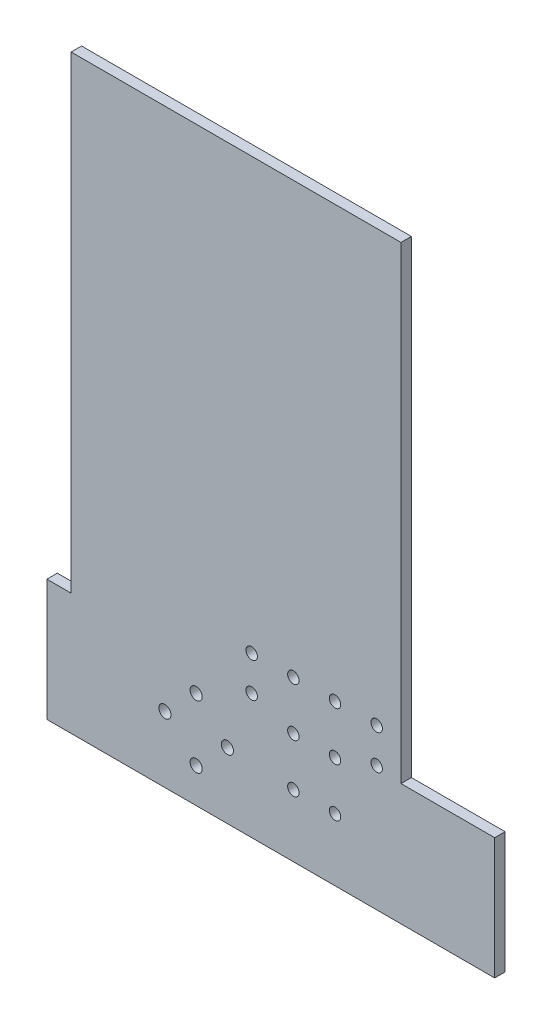
ISO-10303-21;
HEADER;
FILE_DESCRIPTION(('STEP AP214'),'2;1');
FILE_NAME('part.step','',(''),(''),'','','');
FILE_SCHEMA(('AUTOMOTIVE_DESIGN { 1 0 10303 214 1 1 1 1 }'));
ENDSEC;
DATA;
#1=APPLICATION_CONTEXT('core data for automotive mechanical design processes');
#2=APPLICATION_PROTOCOL_DEFINITION('international standard','automotive_design',2000,#1);
#3=PRODUCT_CONTEXT('',#1,'mechanical');
#4=PRODUCT('Part','Part','',(#3));
#5=PRODUCT_RELATED_PRODUCT_CATEGORY('part','',(#4));
#6=PRODUCT_DEFINITION_FORMATION('','',#4);
#7=PRODUCT_DEFINITION_CONTEXT('part definition',#1,'design');
#8=PRODUCT_DEFINITION('design','',#6,#7);
#9=PRODUCT_DEFINITION_SHAPE('','',#8);
#10=(LENGTH_UNIT() NAMED_UNIT(*) SI_UNIT(.MILLI.,.METRE.));
#11=(NAMED_UNIT(*) PLANE_ANGLE_UNIT() SI_UNIT($,.RADIAN.));
#12=(NAMED_UNIT(*) SI_UNIT($,.STERADIAN.) SOLID_ANGLE_UNIT());
#13=UNCERTAINTY_MEASURE_WITH_UNIT(LENGTH_MEASURE(1.E-05),#10,'distance_accuracy_value','');
#14=(GEOMETRIC_REPRESENTATION_CONTEXT(3) GLOBAL_UNCERTAINTY_ASSIGNED_CONTEXT((#13)) GLOBAL_UNIT_ASSIGNED_CONTEXT((#10,
#11,#12)) REPRESENTATION_CONTEXT('',''));
#15=CARTESIAN_POINT('',(0.,0.,0.));
#16=DIRECTION('',(0.,0.,1.));
#17=DIRECTION('',(1.,0.,0.));
#18=AXIS2_PLACEMENT_3D('',#15,#16,#17);
#19=CARTESIAN_POINT('',(0.,0.,3.));
#20=DIRECTION('',(0.,-1.,0.));
#21=DIRECTION('',(0.,0.,-1.));
#22=AXIS2_PLACEMENT_3D('',#19,#20,#21);
#23=PLANE('',#22);
#24=DIRECTION('',(0.,0.,1.));
#25=VECTOR('',#24,1.);
#26=CARTESIAN_POINT('',(-17.,0.,0.));
#27=LINE('',#26,#25);
#28=CARTESIAN_POINT('',(-17.,0.,0.));
#29=VERTEX_POINT('',#28);
#30=CARTESIAN_POINT('',(-17.,0.,3.));
#31=VERTEX_POINT('',#30);
#32=EDGE_CURVE('E137',#29,#31,#27,.T.);
#33=ORIENTED_EDGE('',*,*,#32,.F.);
#34=DIRECTION('',(-1.,0.,0.));
#35=VECTOR('',#34,1.);
#36=CARTESIAN_POINT('',(0.,0.,0.));
#37=LINE('',#36,#35);
#38=CARTESIAN_POINT('',(-24.,0.,0.));
#39=VERTEX_POINT('',#38);
#40=EDGE_CURVE('E79',#29,#39,#37,.T.);
#41=ORIENTED_EDGE('',*,*,#40,.T.);
#42=DIRECTION('',(0.,0.,1.));
#43=VECTOR('',#42,1.);
#44=CARTESIAN_POINT('',(-24.,0.,0.));
#45=LINE('',#44,#43);
#46=CARTESIAN_POINT('',(-24.,0.,3.));
#47=VERTEX_POINT('',#46);
#48=EDGE_CURVE('E128',#39,#47,#45,.T.);
#49=ORIENTED_EDGE('',*,*,#48,.T.);
#50=DIRECTION('',(-1.,0.,0.));
#51=VECTOR('',#50,1.);
#52=CARTESIAN_POINT('',(0.,0.,3.));
#53=LINE('',#52,#51);
#54=EDGE_CURVE('E102',#31,#47,#53,.T.);
#55=ORIENTED_EDGE('',*,*,#54,.F.);
#56=EDGE_LOOP('',(#33,#41,#49,#55));
#57=FACE_BOUND('',#56,.T.);
#58=ADVANCED_FACE('F35',(#57),#23,.F.);
#59=CARTESIAN_POINT('',(0.,0.,3.));
#60=DIRECTION('',(0.,0.,1.));
#61=DIRECTION('',(1.,0.,0.));
#62=AXIS2_PLACEMENT_3D('',#59,#60,#61);
#63=PLANE('',#62);
#64=CARTESIAN_POINT('',(47.,-17.000000000004,3.));
#65=DIRECTION('',(0.,0.,1.));
#66=DIRECTION('',(1.,0.,0.));
#67=AXIS2_PLACEMENT_3D('',#64,#65,#66);
#68=CIRCLE('',#67,1.65000000000128);
#69=CARTESIAN_POINT('',(48.6500000000013,-17.000000000004,3.));
#70=VERTEX_POINT('',#69);
#71=EDGE_CURVE('E194',#70,#70,#68,.T.);
#72=ORIENTED_EDGE('',*,*,#71,.F.);
#73=EDGE_LOOP('',(#72));
#74=FACE_BOUND('',#73,.T.);
#75=CARTESIAN_POINT('',(71.,0.999999999996025,3.));
#76=DIRECTION('',(0.,0.,1.));
#77=DIRECTION('',(1.,0.,0.));
#78=AXIS2_PLACEMENT_3D('',#75,#76,#77);
#79=CIRCLE('',#78,1.65000000000128);
#80=CARTESIAN_POINT('',(72.6500000000013,0.999999999996025,3.));
#81=VERTEX_POINT('',#80);
#82=EDGE_CURVE('E201',#81,#81,#79,.T.);
#83=ORIENTED_EDGE('',*,*,#82,.F.);
#84=EDGE_LOOP('',(#83));
#85=FACE_BOUND('',#84,.T.);
#86=CARTESIAN_POINT('',(35.,0.999999999996032,3.));
#87=DIRECTION('',(0.,0.,1.));
#88=DIRECTION('',(1.,0.,0.));
#89=AXIS2_PLACEMENT_3D('',#86,#87,#88);
#90=CIRCLE('',#89,1.65000000000128);
#91=CARTESIAN_POINT('',(36.6500000000013,0.999999999996032,3.));
#92=VERTEX_POINT('',#91);
#93=EDGE_CURVE('E207',#92,#92,#90,.T.);
#94=ORIENTED_EDGE('',*,*,#93,.F.);
#95=EDGE_LOOP('',(#94));
#96=FACE_BOUND('',#95,.T.);
#97=CARTESIAN_POINT('',(35.,10.999999999996,3.));
#98=DIRECTION('',(0.,0.,1.));
#99=DIRECTION('',(1.,0.,0.));
#100=AXIS2_PLACEMENT_3D('',#97,#98,#99);
#101=CIRCLE('',#100,1.65000000000128);
#102=CARTESIAN_POINT('',(36.6500000000013,10.999999999996,3.));
#103=VERTEX_POINT('',#102);
#104=EDGE_CURVE('E213',#103,#103,#101,.T.);
#105=ORIENTED_EDGE('',*,*,#104,.F.);
#106=EDGE_LOOP('',(#105));
#107=FACE_BOUND('',#106,.T.);
#108=CARTESIAN_POINT('',(59.,-3.00000000000397,3.));
#109=DIRECTION('',(0.,0.,1.));
#110=DIRECTION('',(1.,0.,0.));
#111=AXIS2_PLACEMENT_3D('',#108,#109,#110);
#112=CIRCLE('',#111,1.65000000000128);
#113=CARTESIAN_POINT('',(60.6500000000013,-3.00000000000397,3.));
#114=VERTEX_POINT('',#113);
#115=EDGE_CURVE('E177',#114,#114,#112,.T.);
#116=ORIENTED_EDGE('',*,*,#115,.F.);
#117=EDGE_LOOP('',(#116));
#118=FACE_BOUND('',#117,.T.);
#119=CARTESIAN_POINT('',(47.,10.999999999996,3.));
#120=DIRECTION('',(0.,0.,1.));
#121=DIRECTION('',(1.,0.,0.));
#122=AXIS2_PLACEMENT_3D('',#119,#120,#121);
#123=CIRCLE('',#122,1.65000000000128);
#124=CARTESIAN_POINT('',(48.6500000000013,10.999999999996,3.));
#125=VERTEX_POINT('',#124);
#126=EDGE_CURVE('E170',#125,#125,#123,.T.);
#127=ORIENTED_EDGE('',*,*,#126,.F.);
#128=EDGE_LOOP('',(#127));
#129=FACE_BOUND('',#128,.T.);
#130=CARTESIAN_POINT('',(59.,10.999999999996,3.));
#131=DIRECTION('',(0.,0.,1.));
#132=DIRECTION('',(1.,0.,0.));
#133=AXIS2_PLACEMENT_3D('',#130,#131,#132);
#134=CIRCLE('',#133,1.65000000000128);
#135=CARTESIAN_POINT('',(60.6500000000013,10.999999999996,3.));
#136=VERTEX_POINT('',#135);
#137=EDGE_CURVE('E189',#136,#136,#134,.T.);
#138=ORIENTED_EDGE('',*,*,#137,.F.);
#139=EDGE_LOOP('',(#138));
#140=FACE_BOUND('',#139,.T.);
#141=CARTESIAN_POINT('',(71.,10.999999999996,3.));
#142=DIRECTION('',(0.,0.,1.));
#143=DIRECTION('',(1.,0.,0.));
#144=AXIS2_PLACEMENT_3D('',#141,#142,#143);
#145=CIRCLE('',#144,1.65000000000128);
#146=CARTESIAN_POINT('',(72.6500000000013,10.999999999996,3.));
#147=VERTEX_POINT('',#146);
#148=EDGE_CURVE('E182',#147,#147,#145,.T.);
#149=ORIENTED_EDGE('',*,*,#148,.F.);
#150=EDGE_LOOP('',(#149));
#151=FACE_BOUND('',#150,.T.);
#152=CARTESIAN_POINT('',(59.,-17.000000000004,3.));
#153=DIRECTION('',(0.,0.,1.));
#154=DIRECTION('',(1.,0.,0.));
#155=AXIS2_PLACEMENT_3D('',#152,#153,#154);
#156=CIRCLE('',#155,1.65000000000128);
#157=CARTESIAN_POINT('',(60.6500000000013,-17.000000000004,3.));
#158=VERTEX_POINT('',#157);
#159=EDGE_CURVE('E218',#158,#158,#156,.T.);
#160=ORIENTED_EDGE('',*,*,#159,.F.);
#161=EDGE_LOOP('',(#160));
#162=FACE_BOUND('',#161,.T.);
#163=CARTESIAN_POINT('',(47.,-3.00000000000397,3.));
#164=DIRECTION('',(0.,0.,1.));
#165=DIRECTION('',(1.,0.,0.));
#166=AXIS2_PLACEMENT_3D('',#163,#164,#165);
#167=CIRCLE('',#166,1.65000000000128);
#168=CARTESIAN_POINT('',(48.6500000000013,-3.00000000000397,3.));
#169=VERTEX_POINT('',#168);
#170=EDGE_CURVE('E164',#169,#169,#167,.T.);
#171=ORIENTED_EDGE('',*,*,#170,.F.);
#172=EDGE_LOOP('',(#171));
#173=FACE_BOUND('',#172,.T.);
#174=CARTESIAN_POINT('',(19.,-25.,3.));
#175=DIRECTION('',(0.,0.,1.));
#176=DIRECTION('',(1.,0.,0.));
#177=AXIS2_PLACEMENT_3D('',#174,#175,#176);
#178=CIRCLE('',#177,1.75);
#179=CARTESIAN_POINT('',(20.75,-25.,3.));
#180=VERTEX_POINT('',#179);
#181=EDGE_CURVE('E113',#180,#180,#178,.T.);
#182=ORIENTED_EDGE('',*,*,#181,.F.);
#183=EDGE_LOOP('',(#182));
#184=FACE_BOUND('',#183,.T.);
#185=CARTESIAN_POINT('',(19.,-7.00000000000001,3.));
#186=DIRECTION('',(0.,0.,1.));
#187=DIRECTION('',(1.,0.,0.));
#188=AXIS2_PLACEMENT_3D('',#185,#186,#187);
#189=CIRCLE('',#188,1.75);
#190=CARTESIAN_POINT('',(20.75,-7.00000000000001,3.));
#191=VERTEX_POINT('',#190);
#192=EDGE_CURVE('E100',#191,#191,#189,.T.);
#193=ORIENTED_EDGE('',*,*,#192,.F.);
#194=EDGE_LOOP('',(#193));
#195=FACE_BOUND('',#194,.T.);
#196=CARTESIAN_POINT('',(105.,0.,3.));
#197=VERTEX_POINT('',#196);
#198=CARTESIAN_POINT('',(78.,0.,3.));
#199=VERTEX_POINT('',#198);
#200=EDGE_CURVE('E87',#197,#199,#53,.T.);
#201=ORIENTED_EDGE('',*,*,#200,.T.);
#202=DIRECTION('',(0.,1.,0.));
#203=VECTOR('',#202,1.);
#204=CARTESIAN_POINT('',(78.,135.,3.));
#205=LINE('',#204,#203);
#206=CARTESIAN_POINT('',(78.,135.,3.));
#207=VERTEX_POINT('',#206);
#208=EDGE_CURVE('E50',#199,#207,#205,.T.);
#209=ORIENTED_EDGE('',*,*,#208,.T.);
#210=DIRECTION('',(-1.,0.,0.));
#211=VECTOR('',#210,1.);
#212=CARTESIAN_POINT('',(-17.,135.,3.));
#213=LINE('',#212,#211);
#214=CARTESIAN_POINT('',(-17.,135.,3.));
#215=VERTEX_POINT('',#214);
#216=EDGE_CURVE('E153',#207,#215,#213,.T.);
#217=ORIENTED_EDGE('',*,*,#216,.T.);
#218=DIRECTION('',(0.,-1.,0.));
#219=VECTOR('',#218,1.);
#220=CARTESIAN_POINT('',(-17.,0.,3.));
#221=LINE('',#220,#219);
#222=EDGE_CURVE('E150',#215,#31,#221,.T.);
#223=ORIENTED_EDGE('',*,*,#222,.T.);
#224=ORIENTED_EDGE('',*,*,#54,.T.);
#225=DIRECTION('',(0.,-1.,0.));
#226=VECTOR('',#225,1.);
#227=CARTESIAN_POINT('',(-24.,0.,3.));
#228=LINE('',#227,#226);
#229=CARTESIAN_POINT('',(-24.,-35.,3.));
#230=VERTEX_POINT('',#229);
#231=EDGE_CURVE('E134',#47,#230,#228,.T.);
#232=ORIENTED_EDGE('',*,*,#231,.T.);
#233=DIRECTION('',(1.,0.,0.));
#234=VECTOR('',#233,1.);
#235=CARTESIAN_POINT('',(0.,-35.,3.));
#236=LINE('',#235,#234);
#237=CARTESIAN_POINT('',(105.,-35.,3.));
#238=VERTEX_POINT('',#237);
#239=EDGE_CURVE('E94',#230,#238,#236,.T.);
#240=ORIENTED_EDGE('',*,*,#239,.T.);
#241=DIRECTION('',(0.,1.,0.));
#242=VECTOR('',#241,1.);
#243=CARTESIAN_POINT('',(105.,0.,3.));
#244=LINE('',#243,#242);
#245=EDGE_CURVE('E59',#238,#197,#244,.T.);
#246=ORIENTED_EDGE('',*,*,#245,.T.);
#247=EDGE_LOOP('',(#201,#209,#217,#223,#224,#232,#240,#246));
#248=FACE_BOUND('',#247,.T.);
#249=CARTESIAN_POINT('',(10.,-16.,3.));
#250=DIRECTION('',(0.,0.,1.));
#251=DIRECTION('',(1.,0.,0.));
#252=AXIS2_PLACEMENT_3D('',#249,#250,#251);
#253=CIRCLE('',#252,1.75);
#254=CARTESIAN_POINT('',(11.75,-16.,3.));
#255=VERTEX_POINT('',#254);
#256=EDGE_CURVE('E107',#255,#255,#253,.T.);
#257=ORIENTED_EDGE('',*,*,#256,.F.);
#258=EDGE_LOOP('',(#257));
#259=FACE_BOUND('',#258,.T.);
#260=CARTESIAN_POINT('',(28.,-16.,3.));
#261=DIRECTION('',(0.,0.,1.));
#262=DIRECTION('',(1.,0.,0.));
#263=AXIS2_PLACEMENT_3D('',#260,#261,#262);
#264=CIRCLE('',#263,1.75);
#265=CARTESIAN_POINT('',(29.75,-16.,3.));
#266=VERTEX_POINT('',#265);
#267=EDGE_CURVE('E119',#266,#266,#264,.T.);
#268=ORIENTED_EDGE('',*,*,#267,.F.);
#269=EDGE_LOOP('',(#268));
#270=FACE_BOUND('',#269,.T.);
#271=ADVANCED_FACE('F234',(#74,#85,#96,#107,#118,#129,#140,#151,#162,#173,#184,#195,#248,#259,
#270),#63,.T.);
#272=CARTESIAN_POINT('',(0.,0.,0.));
#273=DIRECTION('',(0.,0.,1.));
#274=DIRECTION('',(1.,0.,0.));
#275=AXIS2_PLACEMENT_3D('',#272,#273,#274);
#276=PLANE('',#275);
#277=CARTESIAN_POINT('',(47.,-17.000000000004,0.));
#278=DIRECTION('',(0.,0.,1.));
#279=DIRECTION('',(1.,0.,0.));
#280=AXIS2_PLACEMENT_3D('',#277,#278,#279);
#281=CIRCLE('',#280,1.65000000000128);
#282=CARTESIAN_POINT('',(48.6500000000013,-17.000000000004,0.));
#283=VERTEX_POINT('',#282);
#284=EDGE_CURVE('E197',#283,#283,#281,.T.);
#285=ORIENTED_EDGE('',*,*,#284,.T.);
#286=EDGE_LOOP('',(#285));
#287=FACE_BOUND('',#286,.T.);
#288=CARTESIAN_POINT('',(71.,0.999999999996025,0.));
#289=DIRECTION('',(0.,0.,1.));
#290=DIRECTION('',(1.,0.,0.));
#291=AXIS2_PLACEMENT_3D('',#288,#289,#290);
#292=CIRCLE('',#291,1.65000000000128);
#293=CARTESIAN_POINT('',(72.6500000000013,0.999999999996025,0.));
#294=VERTEX_POINT('',#293);
#295=EDGE_CURVE('E204',#294,#294,#292,.T.);
#296=ORIENTED_EDGE('',*,*,#295,.T.);
#297=EDGE_LOOP('',(#296));
#298=FACE_BOUND('',#297,.T.);
#299=CARTESIAN_POINT('',(35.,0.999999999996032,0.));
#300=DIRECTION('',(0.,0.,1.));
#301=DIRECTION('',(1.,0.,0.));
#302=AXIS2_PLACEMENT_3D('',#299,#300,#301);
#303=CIRCLE('',#302,1.65000000000128);
#304=CARTESIAN_POINT('',(36.6500000000013,0.999999999996032,0.));
#305=VERTEX_POINT('',#304);
#306=EDGE_CURVE('E210',#305,#305,#303,.T.);
#307=ORIENTED_EDGE('',*,*,#306,.T.);
#308=EDGE_LOOP('',(#307));
#309=FACE_BOUND('',#308,.T.);
#310=CARTESIAN_POINT('',(35.,10.999999999996,0.));
#311=DIRECTION('',(0.,0.,1.));
#312=DIRECTION('',(1.,0.,0.));
#313=AXIS2_PLACEMENT_3D('',#310,#311,#312);
#314=CIRCLE('',#313,1.65000000000128);
#315=CARTESIAN_POINT('',(36.6500000000013,10.999999999996,0.));
#316=VERTEX_POINT('',#315);
#317=EDGE_CURVE('E186',#316,#316,#314,.T.);
#318=ORIENTED_EDGE('',*,*,#317,.T.);
#319=EDGE_LOOP('',(#318));
#320=FACE_BOUND('',#319,.T.);
#321=CARTESIAN_POINT('',(59.,-3.00000000000397,0.));
#322=DIRECTION('',(0.,0.,1.));
#323=DIRECTION('',(1.,0.,0.));
#324=AXIS2_PLACEMENT_3D('',#321,#322,#323);
#325=CIRCLE('',#324,1.65000000000128);
#326=CARTESIAN_POINT('',(60.6500000000013,-3.00000000000397,0.));
#327=VERTEX_POINT('',#326);
#328=EDGE_CURVE('E167',#327,#327,#325,.T.);
#329=ORIENTED_EDGE('',*,*,#328,.T.);
#330=EDGE_LOOP('',(#329));
#331=FACE_BOUND('',#330,.T.);
#332=CARTESIAN_POINT('',(47.,10.999999999996,0.));
#333=DIRECTION('',(0.,0.,1.));
#334=DIRECTION('',(1.,0.,0.));
#335=AXIS2_PLACEMENT_3D('',#332,#333,#334);
#336=CIRCLE('',#335,1.65000000000128);
#337=CARTESIAN_POINT('',(48.6500000000013,10.999999999996,0.));
#338=VERTEX_POINT('',#337);
#339=EDGE_CURVE('E173',#338,#338,#336,.T.);
#340=ORIENTED_EDGE('',*,*,#339,.T.);
#341=EDGE_LOOP('',(#340));
#342=FACE_BOUND('',#341,.T.);
#343=CARTESIAN_POINT('',(59.,10.999999999996,0.));
#344=DIRECTION('',(0.,0.,1.));
#345=DIRECTION('',(1.,0.,0.));
#346=AXIS2_PLACEMENT_3D('',#343,#344,#345);
#347=CIRCLE('',#346,1.65000000000128);
#348=CARTESIAN_POINT('',(60.6500000000013,10.999999999996,0.));
#349=VERTEX_POINT('',#348);
#350=EDGE_CURVE('E174',#349,#349,#347,.T.);
#351=ORIENTED_EDGE('',*,*,#350,.T.);
#352=EDGE_LOOP('',(#351));
#353=FACE_BOUND('',#352,.T.);
#354=CARTESIAN_POINT('',(71.,10.999999999996,0.));
#355=DIRECTION('',(0.,0.,1.));
#356=DIRECTION('',(1.,0.,0.));
#357=AXIS2_PLACEMENT_3D('',#354,#355,#356);
#358=CIRCLE('',#357,1.65000000000128);
#359=CARTESIAN_POINT('',(72.6500000000013,10.999999999996,0.));
#360=VERTEX_POINT('',#359);
#361=EDGE_CURVE('E185',#360,#360,#358,.T.);
#362=ORIENTED_EDGE('',*,*,#361,.T.);
#363=EDGE_LOOP('',(#362));
#364=FACE_BOUND('',#363,.T.);
#365=CARTESIAN_POINT('',(59.,-17.000000000004,0.));
#366=DIRECTION('',(0.,0.,1.));
#367=DIRECTION('',(1.,0.,0.));
#368=AXIS2_PLACEMENT_3D('',#365,#366,#367);
#369=CIRCLE('',#368,1.65000000000128);
#370=CARTESIAN_POINT('',(60.6500000000013,-17.000000000004,0.));
#371=VERTEX_POINT('',#370);
#372=EDGE_CURVE('E198',#371,#371,#369,.T.);
#373=ORIENTED_EDGE('',*,*,#372,.T.);
#374=EDGE_LOOP('',(#373));
#375=FACE_BOUND('',#374,.T.);
#376=CARTESIAN_POINT('',(47.,-3.00000000000397,0.));
#377=DIRECTION('',(0.,0.,1.));
#378=DIRECTION('',(1.,0.,0.));
#379=AXIS2_PLACEMENT_3D('',#376,#377,#378);
#380=CIRCLE('',#379,1.65000000000128);
#381=CARTESIAN_POINT('',(48.6500000000013,-3.00000000000397,0.));
#382=VERTEX_POINT('',#381);
#383=EDGE_CURVE('E157',#382,#382,#380,.T.);
#384=ORIENTED_EDGE('',*,*,#383,.T.);
#385=EDGE_LOOP('',(#384));
#386=FACE_BOUND('',#385,.T.);
#387=DIRECTION('',(1.,0.,0.));
#388=VECTOR('',#387,1.);
#389=CARTESIAN_POINT('',(0.,-35.,0.));
#390=LINE('',#389,#388);
#391=CARTESIAN_POINT('',(-24.,-35.,0.));
#392=VERTEX_POINT('',#391);
#393=CARTESIAN_POINT('',(105.,-35.,0.));
#394=VERTEX_POINT('',#393);
#395=EDGE_CURVE('E80',#392,#394,#390,.T.);
#396=ORIENTED_EDGE('',*,*,#395,.F.);
#397=DIRECTION('',(0.,-1.,0.));
#398=VECTOR('',#397,1.);
#399=CARTESIAN_POINT('',(-24.,0.,0.));
#400=LINE('',#399,#398);
#401=EDGE_CURVE('E131',#39,#392,#400,.T.);
#402=ORIENTED_EDGE('',*,*,#401,.F.);
#403=ORIENTED_EDGE('',*,*,#40,.F.);
#404=DIRECTION('',(0.,-1.,0.));
#405=VECTOR('',#404,1.);
#406=CARTESIAN_POINT('',(-17.,0.,0.));
#407=LINE('',#406,#405);
#408=CARTESIAN_POINT('',(-17.,135.,0.));
#409=VERTEX_POINT('',#408);
#410=EDGE_CURVE('E143',#409,#29,#407,.T.);
#411=ORIENTED_EDGE('',*,*,#410,.F.);
#412=DIRECTION('',(-1.,0.,0.));
#413=VECTOR('',#412,1.);
#414=CARTESIAN_POINT('',(-17.,135.,0.));
#415=LINE('',#414,#413);
#416=CARTESIAN_POINT('',(78.,135.,0.));
#417=VERTEX_POINT('',#416);
#418=EDGE_CURVE('E160',#417,#409,#415,.T.);
#419=ORIENTED_EDGE('',*,*,#418,.F.);
#420=DIRECTION('',(0.,1.,0.));
#421=VECTOR('',#420,1.);
#422=CARTESIAN_POINT('',(78.,135.,0.));
#423=LINE('',#422,#421);
#424=CARTESIAN_POINT('',(78.,0.,0.));
#425=VERTEX_POINT('',#424);
#426=EDGE_CURVE('E93',#425,#417,#423,.T.);
#427=ORIENTED_EDGE('',*,*,#426,.F.);
#428=CARTESIAN_POINT('',(105.,0.,0.));
#429=VERTEX_POINT('',#428);
#430=EDGE_CURVE('E86',#429,#425,#37,.T.);
#431=ORIENTED_EDGE('',*,*,#430,.F.);
#432=DIRECTION('',(0.,1.,0.));
#433=VECTOR('',#432,1.);
#434=CARTESIAN_POINT('',(105.,0.,0.));
#435=LINE('',#434,#433);
#436=EDGE_CURVE('E71',#394,#429,#435,.T.);
#437=ORIENTED_EDGE('',*,*,#436,.F.);
#438=EDGE_LOOP('',(#396,#402,#403,#411,#419,#427,#431,#437));
#439=FACE_BOUND('',#438,.T.);
#440=CARTESIAN_POINT('',(19.,-7.00000000000001,0.));
#441=DIRECTION('',(0.,0.,1.));
#442=DIRECTION('',(1.,0.,0.));
#443=AXIS2_PLACEMENT_3D('',#440,#441,#442);
#444=CIRCLE('',#443,1.75);
#445=CARTESIAN_POINT('',(20.75,-7.00000000000001,0.));
#446=VERTEX_POINT('',#445);
#447=EDGE_CURVE('E104',#446,#446,#444,.T.);
#448=ORIENTED_EDGE('',*,*,#447,.T.);
#449=EDGE_LOOP('',(#448));
#450=FACE_BOUND('',#449,.T.);
#451=CARTESIAN_POINT('',(10.,-16.,0.));
#452=DIRECTION('',(0.,0.,1.));
#453=DIRECTION('',(1.,0.,0.));
#454=AXIS2_PLACEMENT_3D('',#451,#452,#453);
#455=CIRCLE('',#454,1.75);
#456=CARTESIAN_POINT('',(11.75,-16.,0.));
#457=VERTEX_POINT('',#456);
#458=EDGE_CURVE('E110',#457,#457,#455,.T.);
#459=ORIENTED_EDGE('',*,*,#458,.T.);
#460=EDGE_LOOP('',(#459));
#461=FACE_BOUND('',#460,.T.);
#462=CARTESIAN_POINT('',(19.,-25.,0.));
#463=DIRECTION('',(0.,0.,1.));
#464=DIRECTION('',(1.,0.,0.));
#465=AXIS2_PLACEMENT_3D('',#462,#463,#464);
#466=CIRCLE('',#465,1.75);
#467=CARTESIAN_POINT('',(20.75,-25.,0.));
#468=VERTEX_POINT('',#467);
#469=EDGE_CURVE('E116',#468,#468,#466,.T.);
#470=ORIENTED_EDGE('',*,*,#469,.T.);
#471=EDGE_LOOP('',(#470));
#472=FACE_BOUND('',#471,.T.);
#473=CARTESIAN_POINT('',(28.,-16.,0.));
#474=DIRECTION('',(0.,0.,1.));
#475=DIRECTION('',(1.,0.,0.));
#476=AXIS2_PLACEMENT_3D('',#473,#474,#475);
#477=CIRCLE('',#476,1.75);
#478=CARTESIAN_POINT('',(29.75,-16.,0.));
#479=VERTEX_POINT('',#478);
#480=EDGE_CURVE('E122',#479,#479,#477,.T.);
#481=ORIENTED_EDGE('',*,*,#480,.T.);
#482=EDGE_LOOP('',(#481));
#483=FACE_BOUND('',#482,.T.);
#484=ADVANCED_FACE('F89',(#287,#298,#309,#320,#331,#342,#353,#364,#375,#386,#439,#450,#461,#472,
#483),#276,.F.);
#485=CARTESIAN_POINT('',(0.,-35.,3.));
#486=DIRECTION('',(0.,1.,0.));
#487=DIRECTION('',(0.,0.,1.));
#488=AXIS2_PLACEMENT_3D('',#485,#486,#487);
#489=PLANE('',#488);
#490=ORIENTED_EDGE('',*,*,#395,.T.);
#491=DIRECTION('',(0.,0.,-1.));
#492=VECTOR('',#491,1.);
#493=CARTESIAN_POINT('',(105.,-35.,3.));
#494=LINE('',#493,#492);
#495=EDGE_CURVE('E11',#238,#394,#494,.T.);
#496=ORIENTED_EDGE('',*,*,#495,.F.);
#497=ORIENTED_EDGE('',*,*,#239,.F.);
#498=DIRECTION('',(0.,0.,1.));
#499=VECTOR('',#498,1.);
#500=CARTESIAN_POINT('',(-24.,-35.,0.));
#501=LINE('',#500,#499);
#502=EDGE_CURVE('E125',#392,#230,#501,.T.);
#503=ORIENTED_EDGE('',*,*,#502,.F.);
#504=EDGE_LOOP('',(#490,#496,#497,#503));
#505=FACE_BOUND('',#504,.T.);
#506=ADVANCED_FACE('F37',(#505),#489,.F.);
#507=CARTESIAN_POINT('',(105.,0.,3.));
#508=DIRECTION('',(-1.,0.,0.));
#509=DIRECTION('',(0.,0.,1.));
#510=AXIS2_PLACEMENT_3D('',#507,#508,#509);
#511=PLANE('',#510);
#512=ORIENTED_EDGE('',*,*,#436,.T.);
#513=DIRECTION('',(0.,0.,-1.));
#514=VECTOR('',#513,1.);
#515=CARTESIAN_POINT('',(105.,0.,3.));
#516=LINE('',#515,#514);
#517=EDGE_CURVE('E43',#197,#429,#516,.T.);
#518=ORIENTED_EDGE('',*,*,#517,.F.);
#519=ORIENTED_EDGE('',*,*,#245,.F.);
#520=ORIENTED_EDGE('',*,*,#495,.T.);
#521=EDGE_LOOP('',(#512,#518,#519,#520));
#522=FACE_BOUND('',#521,.T.);
#523=ADVANCED_FACE('F73',(#522),#511,.F.);
#524=ORIENTED_EDGE('',*,*,#430,.T.);
#525=DIRECTION('',(0.,0.,1.));
#526=VECTOR('',#525,1.);
#527=CARTESIAN_POINT('',(78.,0.,0.));
#528=LINE('',#527,#526);
#529=EDGE_CURVE('E140',#425,#199,#528,.T.);
#530=ORIENTED_EDGE('',*,*,#529,.T.);
#531=ORIENTED_EDGE('',*,*,#200,.F.);
#532=ORIENTED_EDGE('',*,*,#517,.T.);
#533=EDGE_LOOP('',(#524,#530,#531,#532));
#534=FACE_BOUND('',#533,.T.);
#535=ADVANCED_FACE('F84',(#534),#23,.F.);
#536=CARTESIAN_POINT('',(19.,-7.00000000000001,3.));
#537=DIRECTION('',(0.,0.,-1.));
#538=DIRECTION('',(-1.,0.,0.));
#539=AXIS2_PLACEMENT_3D('',#536,#537,#538);
#540=CYLINDRICAL_SURFACE('',#539,1.75);
#541=ORIENTED_EDGE('',*,*,#192,.T.);
#542=EDGE_LOOP('',(#541));
#543=FACE_BOUND('',#542,.T.);
#544=ORIENTED_EDGE('',*,*,#447,.F.);
#545=EDGE_LOOP('',(#544));
#546=FACE_BOUND('',#545,.T.);
#547=ADVANCED_FACE('F272',(#543,#546),#540,.F.);
#548=CARTESIAN_POINT('',(10.,-16.,3.));
#549=DIRECTION('',(0.,0.,-1.));
#550=DIRECTION('',(-1.,0.,0.));
#551=AXIS2_PLACEMENT_3D('',#548,#549,#550);
#552=CYLINDRICAL_SURFACE('',#551,1.75);
#553=ORIENTED_EDGE('',*,*,#256,.T.);
#554=EDGE_LOOP('',(#553));
#555=FACE_BOUND('',#554,.T.);
#556=ORIENTED_EDGE('',*,*,#458,.F.);
#557=EDGE_LOOP('',(#556));
#558=FACE_BOUND('',#557,.T.);
#559=ADVANCED_FACE('F277',(#555,#558),#552,.F.);
#560=CARTESIAN_POINT('',(19.,-25.,3.));
#561=DIRECTION('',(0.,0.,-1.));
#562=DIRECTION('',(-1.,0.,0.));
#563=AXIS2_PLACEMENT_3D('',#560,#561,#562);
#564=CYLINDRICAL_SURFACE('',#563,1.75);
#565=ORIENTED_EDGE('',*,*,#181,.T.);
#566=EDGE_LOOP('',(#565));
#567=FACE_BOUND('',#566,.T.);
#568=ORIENTED_EDGE('',*,*,#469,.F.);
#569=EDGE_LOOP('',(#568));
#570=FACE_BOUND('',#569,.T.);
#571=ADVANCED_FACE('F253',(#567,#570),#564,.F.);
#572=CARTESIAN_POINT('',(28.,-16.,3.));
#573=DIRECTION('',(0.,0.,-1.));
#574=DIRECTION('',(-1.,0.,0.));
#575=AXIS2_PLACEMENT_3D('',#572,#573,#574);
#576=CYLINDRICAL_SURFACE('',#575,1.75);
#577=ORIENTED_EDGE('',*,*,#267,.T.);
#578=EDGE_LOOP('',(#577));
#579=FACE_BOUND('',#578,.T.);
#580=ORIENTED_EDGE('',*,*,#480,.F.);
#581=EDGE_LOOP('',(#580));
#582=FACE_BOUND('',#581,.T.);
#583=ADVANCED_FACE('F249',(#579,#582),#576,.F.);
#584=CARTESIAN_POINT('',(-24.,0.,0.));
#585=DIRECTION('',(-1.,0.,0.));
#586=DIRECTION('',(0.,-1.,0.));
#587=AXIS2_PLACEMENT_3D('',#584,#585,#586);
#588=PLANE('',#587);
#589=ORIENTED_EDGE('',*,*,#231,.F.);
#590=ORIENTED_EDGE('',*,*,#48,.F.);
#591=ORIENTED_EDGE('',*,*,#401,.T.);
#592=ORIENTED_EDGE('',*,*,#502,.T.);
#593=EDGE_LOOP('',(#589,#590,#591,#592));
#594=FACE_BOUND('',#593,.T.);
#595=ADVANCED_FACE('F252',(#594),#588,.T.);
#596=CARTESIAN_POINT('',(-17.,0.,0.));
#597=DIRECTION('',(-1.,0.,0.));
#598=DIRECTION('',(0.,0.,1.));
#599=AXIS2_PLACEMENT_3D('',#596,#597,#598);
#600=PLANE('',#599);
#601=ORIENTED_EDGE('',*,*,#222,.F.);
#602=DIRECTION('',(0.,0.,1.));
#603=VECTOR('',#602,1.);
#604=CARTESIAN_POINT('',(-17.,135.,0.));
#605=LINE('',#604,#603);
#606=EDGE_CURVE('E145',#409,#215,#605,.T.);
#607=ORIENTED_EDGE('',*,*,#606,.F.);
#608=ORIENTED_EDGE('',*,*,#410,.T.);
#609=ORIENTED_EDGE('',*,*,#32,.T.);
#610=EDGE_LOOP('',(#601,#607,#608,#609));
#611=FACE_BOUND('',#610,.T.);
#612=ADVANCED_FACE('F302',(#611),#600,.T.);
#613=CARTESIAN_POINT('',(-17.,135.,0.));
#614=DIRECTION('',(0.,1.,0.));
#615=DIRECTION('',(0.,0.,1.));
#616=AXIS2_PLACEMENT_3D('',#613,#614,#615);
#617=PLANE('',#616);
#618=ORIENTED_EDGE('',*,*,#216,.F.);
#619=DIRECTION('',(0.,0.,1.));
#620=VECTOR('',#619,1.);
#621=CARTESIAN_POINT('',(78.,135.,0.));
#622=LINE('',#621,#620);
#623=EDGE_CURVE('E142',#417,#207,#622,.T.);
#624=ORIENTED_EDGE('',*,*,#623,.F.);
#625=ORIENTED_EDGE('',*,*,#418,.T.);
#626=ORIENTED_EDGE('',*,*,#606,.T.);
#627=EDGE_LOOP('',(#618,#624,#625,#626));
#628=FACE_BOUND('',#627,.T.);
#629=ADVANCED_FACE('F323',(#628),#617,.T.);
#630=CARTESIAN_POINT('',(78.,135.,0.));
#631=DIRECTION('',(1.,0.,0.));
#632=DIRECTION('',(0.,1.,0.));
#633=AXIS2_PLACEMENT_3D('',#630,#631,#632);
#634=PLANE('',#633);
#635=ORIENTED_EDGE('',*,*,#208,.F.);
#636=ORIENTED_EDGE('',*,*,#529,.F.);
#637=ORIENTED_EDGE('',*,*,#426,.T.);
#638=ORIENTED_EDGE('',*,*,#623,.T.);
#639=EDGE_LOOP('',(#635,#636,#637,#638));
#640=FACE_BOUND('',#639,.T.);
#641=ADVANCED_FACE('F334',(#640),#634,.T.);
#642=CARTESIAN_POINT('',(47.,-3.00000000000397,0.));
#643=DIRECTION('',(0.,0.,1.));
#644=DIRECTION('',(1.,0.,0.));
#645=AXIS2_PLACEMENT_3D('',#642,#643,#644);
#646=CYLINDRICAL_SURFACE('',#645,1.65000000000128);
#647=ORIENTED_EDGE('',*,*,#383,.F.);
#648=EDGE_LOOP('',(#647));
#649=FACE_BOUND('',#648,.T.);
#650=ORIENTED_EDGE('',*,*,#170,.T.);
#651=EDGE_LOOP('',(#650));
#652=FACE_BOUND('',#651,.T.);
#653=ADVANCED_FACE('F230',(#649,#652),#646,.F.);
#654=CARTESIAN_POINT('',(59.,-17.000000000004,0.));
#655=DIRECTION('',(0.,0.,1.));
#656=DIRECTION('',(1.,0.,0.));
#657=AXIS2_PLACEMENT_3D('',#654,#655,#656);
#658=CYLINDRICAL_SURFACE('',#657,1.65000000000128);
#659=ORIENTED_EDGE('',*,*,#372,.F.);
#660=EDGE_LOOP('',(#659));
#661=FACE_BOUND('',#660,.T.);
#662=ORIENTED_EDGE('',*,*,#159,.T.);
#663=EDGE_LOOP('',(#662));
#664=FACE_BOUND('',#663,.T.);
#665=ADVANCED_FACE('F226',(#661,#664),#658,.F.);
#666=CARTESIAN_POINT('',(71.,10.999999999996,0.));
#667=DIRECTION('',(0.,0.,1.));
#668=DIRECTION('',(1.,0.,0.));
#669=AXIS2_PLACEMENT_3D('',#666,#667,#668);
#670=CYLINDRICAL_SURFACE('',#669,1.65000000000128);
#671=ORIENTED_EDGE('',*,*,#361,.F.);
#672=EDGE_LOOP('',(#671));
#673=FACE_BOUND('',#672,.T.);
#674=ORIENTED_EDGE('',*,*,#148,.T.);
#675=EDGE_LOOP('',(#674));
#676=FACE_BOUND('',#675,.T.);
#677=ADVANCED_FACE('F229',(#673,#676),#670,.F.);
#678=CARTESIAN_POINT('',(59.,10.999999999996,0.));
#679=DIRECTION('',(0.,0.,1.));
#680=DIRECTION('',(1.,0.,0.));
#681=AXIS2_PLACEMENT_3D('',#678,#679,#680);
#682=CYLINDRICAL_SURFACE('',#681,1.65000000000128);
#683=ORIENTED_EDGE('',*,*,#350,.F.);
#684=EDGE_LOOP('',(#683));
#685=FACE_BOUND('',#684,.T.);
#686=ORIENTED_EDGE('',*,*,#137,.T.);
#687=EDGE_LOOP('',(#686));
#688=FACE_BOUND('',#687,.T.);
#689=ADVANCED_FACE('F376',(#685,#688),#682,.F.);
#690=CARTESIAN_POINT('',(47.,10.999999999996,0.));
#691=DIRECTION('',(0.,0.,1.));
#692=DIRECTION('',(1.,0.,0.));
#693=AXIS2_PLACEMENT_3D('',#690,#691,#692);
#694=CYLINDRICAL_SURFACE('',#693,1.65000000000128);
#695=ORIENTED_EDGE('',*,*,#339,.F.);
#696=EDGE_LOOP('',(#695));
#697=FACE_BOUND('',#696,.T.);
#698=ORIENTED_EDGE('',*,*,#126,.T.);
#699=EDGE_LOOP('',(#698));
#700=FACE_BOUND('',#699,.T.);
#701=ADVANCED_FACE('F386',(#697,#700),#694,.F.);
#702=CARTESIAN_POINT('',(59.,-3.00000000000397,0.));
#703=DIRECTION('',(0.,0.,1.));
#704=DIRECTION('',(1.,0.,0.));
#705=AXIS2_PLACEMENT_3D('',#702,#703,#704);
#706=CYLINDRICAL_SURFACE('',#705,1.65000000000128);
#707=ORIENTED_EDGE('',*,*,#328,.F.);
#708=EDGE_LOOP('',(#707));
#709=FACE_BOUND('',#708,.T.);
#710=ORIENTED_EDGE('',*,*,#115,.T.);
#711=EDGE_LOOP('',(#710));
#712=FACE_BOUND('',#711,.T.);
#713=ADVANCED_FACE('F396',(#709,#712),#706,.F.);
#714=CARTESIAN_POINT('',(35.,10.999999999996,0.));
#715=DIRECTION('',(0.,0.,1.));
#716=DIRECTION('',(1.,0.,0.));
#717=AXIS2_PLACEMENT_3D('',#714,#715,#716);
#718=CYLINDRICAL_SURFACE('',#717,1.65000000000128);
#719=ORIENTED_EDGE('',*,*,#317,.F.);
#720=EDGE_LOOP('',(#719));
#721=FACE_BOUND('',#720,.T.);
#722=ORIENTED_EDGE('',*,*,#104,.T.);
#723=EDGE_LOOP('',(#722));
#724=FACE_BOUND('',#723,.T.);
#725=ADVANCED_FACE('F406',(#721,#724),#718,.F.);
#726=CARTESIAN_POINT('',(35.,0.999999999996032,0.));
#727=DIRECTION('',(0.,0.,1.));
#728=DIRECTION('',(1.,0.,0.));
#729=AXIS2_PLACEMENT_3D('',#726,#727,#728);
#730=CYLINDRICAL_SURFACE('',#729,1.65000000000128);
#731=ORIENTED_EDGE('',*,*,#306,.F.);
#732=EDGE_LOOP('',(#731));
#733=FACE_BOUND('',#732,.T.);
#734=ORIENTED_EDGE('',*,*,#93,.T.);
#735=EDGE_LOOP('',(#734));
#736=FACE_BOUND('',#735,.T.);
#737=ADVANCED_FACE('F416',(#733,#736),#730,.F.);
#738=CARTESIAN_POINT('',(71.,0.999999999996025,0.));
#739=DIRECTION('',(0.,0.,1.));
#740=DIRECTION('',(1.,0.,0.));
#741=AXIS2_PLACEMENT_3D('',#738,#739,#740);
#742=CYLINDRICAL_SURFACE('',#741,1.65000000000128);
#743=ORIENTED_EDGE('',*,*,#295,.F.);
#744=EDGE_LOOP('',(#743));
#745=FACE_BOUND('',#744,.T.);
#746=ORIENTED_EDGE('',*,*,#82,.T.);
#747=EDGE_LOOP('',(#746));
#748=FACE_BOUND('',#747,.T.);
#749=ADVANCED_FACE('F426',(#745,#748),#742,.F.);
#750=CARTESIAN_POINT('',(47.,-17.000000000004,0.));
#751=DIRECTION('',(0.,0.,1.));
#752=DIRECTION('',(1.,0.,0.));
#753=AXIS2_PLACEMENT_3D('',#750,#751,#752);
#754=CYLINDRICAL_SURFACE('',#753,1.65000000000128);
#755=ORIENTED_EDGE('',*,*,#284,.F.);
#756=EDGE_LOOP('',(#755));
#757=FACE_BOUND('',#756,.T.);
#758=ORIENTED_EDGE('',*,*,#71,.T.);
#759=EDGE_LOOP('',(#758));
#760=FACE_BOUND('',#759,.T.);
#761=ADVANCED_FACE('F436',(#757,#760),#754,.F.);
#762=CLOSED_SHELL('',(#58,#271,#484,#506,#523,#535,#547,#559,#571,#583,#595,#612,#629,#641,#653,
#665,#677,#689,#701,#713,#725,#737,#749,#761));
#763=MANIFOLD_SOLID_BREP('B2',#762);
#764=ADVANCED_BREP_SHAPE_REPRESENTATION('',(#18,#763),#14);
#765=SHAPE_DEFINITION_REPRESENTATION(#9,#764);
ENDSEC;
END-ISO-10303-21;
